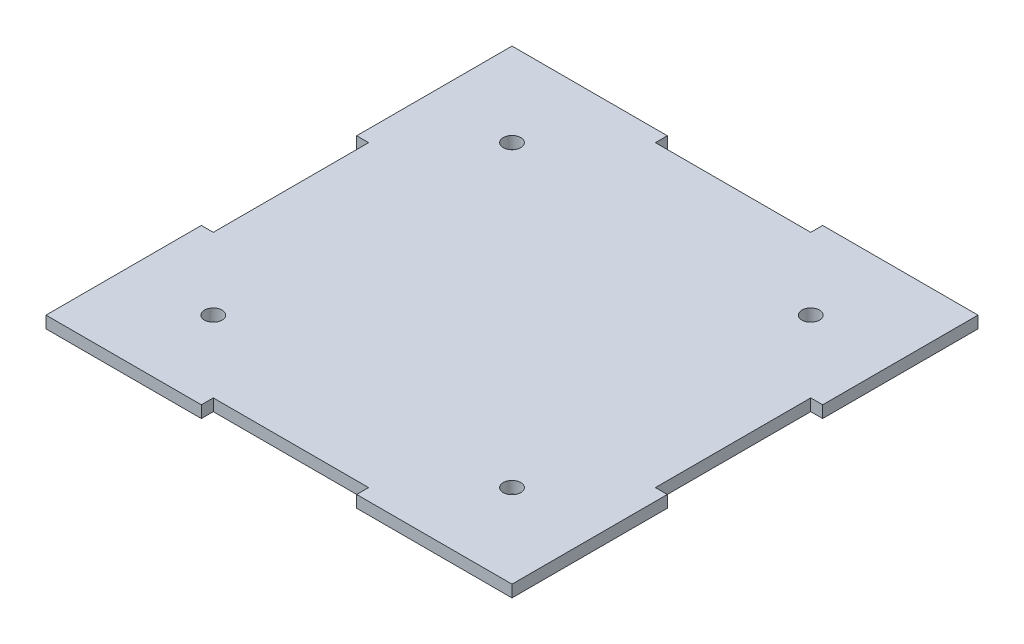
ISO-10303-21;
HEADER;
FILE_DESCRIPTION(('STEP AP214'),'2;1');
FILE_NAME('part.step','',(''),(''),'','','');
FILE_SCHEMA(('AUTOMOTIVE_DESIGN { 1 0 10303 214 1 1 1 1 }'));
ENDSEC;
DATA;
#1=APPLICATION_CONTEXT('core data for automotive mechanical design processes');
#2=APPLICATION_PROTOCOL_DEFINITION('international standard','automotive_design',2000,#1);
#3=PRODUCT_CONTEXT('',#1,'mechanical');
#4=PRODUCT('Part','Part','',(#3));
#5=PRODUCT_RELATED_PRODUCT_CATEGORY('part','',(#4));
#6=PRODUCT_DEFINITION_FORMATION('','',#4);
#7=PRODUCT_DEFINITION_CONTEXT('part definition',#1,'design');
#8=PRODUCT_DEFINITION('design','',#6,#7);
#9=PRODUCT_DEFINITION_SHAPE('','',#8);
#10=(LENGTH_UNIT() NAMED_UNIT(*) SI_UNIT(.MILLI.,.METRE.));
#11=(NAMED_UNIT(*) PLANE_ANGLE_UNIT() SI_UNIT($,.RADIAN.));
#12=(NAMED_UNIT(*) SI_UNIT($,.STERADIAN.) SOLID_ANGLE_UNIT());
#13=UNCERTAINTY_MEASURE_WITH_UNIT(LENGTH_MEASURE(1.E-05),#10,'distance_accuracy_value','');
#14=(GEOMETRIC_REPRESENTATION_CONTEXT(3) GLOBAL_UNCERTAINTY_ASSIGNED_CONTEXT((#13)) GLOBAL_UNIT_ASSIGNED_CONTEXT((#10,
#11,#12)) REPRESENTATION_CONTEXT('',''));
#15=CARTESIAN_POINT('',(0.,0.,0.));
#16=DIRECTION('',(0.,0.,1.));
#17=DIRECTION('',(1.,0.,0.));
#18=AXIS2_PLACEMENT_3D('',#15,#16,#17);
#19=CARTESIAN_POINT('',(0.,3.,0.));
#20=DIRECTION('',(0.,-1.,0.));
#21=DIRECTION('',(0.,0.,-1.));
#22=AXIS2_PLACEMENT_3D('',#19,#20,#21);
#23=PLANE('',#22);
#24=DIRECTION('',(0.,0.,-1.));
#25=VECTOR('',#24,1.);
#26=CARTESIAN_POINT('',(58.5,3.,-58.5));
#27=LINE('',#26,#25);
#28=CARTESIAN_POINT('',(58.5,3.,-19.5));
#29=VERTEX_POINT('',#28);
#30=CARTESIAN_POINT('',(58.5,3.,-58.5));
#31=VERTEX_POINT('',#30);
#32=EDGE_CURVE('E241',#29,#31,#27,.T.);
#33=ORIENTED_EDGE('',*,*,#32,.T.);
#34=DIRECTION('',(-1.,0.,0.));
#35=VECTOR('',#34,1.);
#36=CARTESIAN_POINT('',(19.5,3.,-58.5));
#37=LINE('',#36,#35);
#38=CARTESIAN_POINT('',(19.5,3.,-58.5));
#39=VERTEX_POINT('',#38);
#40=EDGE_CURVE('E129',#31,#39,#37,.T.);
#41=ORIENTED_EDGE('',*,*,#40,.T.);
#42=DIRECTION('',(0.,0.,1.));
#43=VECTOR('',#42,1.);
#44=CARTESIAN_POINT('',(19.5,3.,-55.5));
#45=LINE('',#44,#43);
#46=CARTESIAN_POINT('',(19.5,3.,-55.5));
#47=VERTEX_POINT('',#46);
#48=EDGE_CURVE('E292',#39,#47,#45,.T.);
#49=ORIENTED_EDGE('',*,*,#48,.T.);
#50=DIRECTION('',(-1.,0.,0.));
#51=VECTOR('',#50,1.);
#52=CARTESIAN_POINT('',(-19.5,3.,-55.5));
#53=LINE('',#52,#51);
#54=CARTESIAN_POINT('',(-19.5,3.,-55.5));
#55=VERTEX_POINT('',#54);
#56=EDGE_CURVE('E311',#47,#55,#53,.T.);
#57=ORIENTED_EDGE('',*,*,#56,.T.);
#58=DIRECTION('',(0.,0.,-1.));
#59=VECTOR('',#58,1.);
#60=CARTESIAN_POINT('',(-19.5,3.,-58.5));
#61=LINE('',#60,#59);
#62=CARTESIAN_POINT('',(-19.5,3.,-58.5));
#63=VERTEX_POINT('',#62);
#64=EDGE_CURVE('E308',#55,#63,#61,.T.);
#65=ORIENTED_EDGE('',*,*,#64,.T.);
#66=DIRECTION('',(-1.,0.,0.));
#67=VECTOR('',#66,1.);
#68=CARTESIAN_POINT('',(-58.5,3.,-58.5));
#69=LINE('',#68,#67);
#70=CARTESIAN_POINT('',(-58.5,3.,-58.5));
#71=VERTEX_POINT('',#70);
#72=EDGE_CURVE('E310',#63,#71,#69,.T.);
#73=ORIENTED_EDGE('',*,*,#72,.T.);
#74=DIRECTION('',(0.,0.,1.));
#75=VECTOR('',#74,1.);
#76=CARTESIAN_POINT('',(-58.5,3.,-19.5));
#77=LINE('',#76,#75);
#78=CARTESIAN_POINT('',(-58.5,3.,-19.5));
#79=VERTEX_POINT('',#78);
#80=EDGE_CURVE('E313',#71,#79,#77,.T.);
#81=ORIENTED_EDGE('',*,*,#80,.T.);
#82=DIRECTION('',(1.,0.,0.));
#83=VECTOR('',#82,1.);
#84=CARTESIAN_POINT('',(-55.5,3.,-19.5));
#85=LINE('',#84,#83);
#86=CARTESIAN_POINT('',(-55.5,3.,-19.5));
#87=VERTEX_POINT('',#86);
#88=EDGE_CURVE('E319',#79,#87,#85,.T.);
#89=ORIENTED_EDGE('',*,*,#88,.T.);
#90=DIRECTION('',(0.,0.,1.));
#91=VECTOR('',#90,1.);
#92=CARTESIAN_POINT('',(-55.5,3.,19.5));
#93=LINE('',#92,#91);
#94=CARTESIAN_POINT('',(-55.5,3.,19.5));
#95=VERTEX_POINT('',#94);
#96=EDGE_CURVE('E321',#87,#95,#93,.T.);
#97=ORIENTED_EDGE('',*,*,#96,.T.);
#98=DIRECTION('',(-1.,0.,0.));
#99=VECTOR('',#98,1.);
#100=CARTESIAN_POINT('',(-58.5,3.,19.5));
#101=LINE('',#100,#99);
#102=CARTESIAN_POINT('',(-58.5,3.,19.5));
#103=VERTEX_POINT('',#102);
#104=EDGE_CURVE('E323',#95,#103,#101,.T.);
#105=ORIENTED_EDGE('',*,*,#104,.T.);
#106=DIRECTION('',(0.,0.,1.));
#107=VECTOR('',#106,1.);
#108=CARTESIAN_POINT('',(-58.5,3.,58.5));
#109=LINE('',#108,#107);
#110=CARTESIAN_POINT('',(-58.5,3.,58.5));
#111=VERTEX_POINT('',#110);
#112=EDGE_CURVE('E325',#103,#111,#109,.T.);
#113=ORIENTED_EDGE('',*,*,#112,.T.);
#114=DIRECTION('',(1.,0.,0.));
#115=VECTOR('',#114,1.);
#116=CARTESIAN_POINT('',(-19.5,3.,58.5));
#117=LINE('',#116,#115);
#118=CARTESIAN_POINT('',(-19.5,3.,58.5));
#119=VERTEX_POINT('',#118);
#120=EDGE_CURVE('E327',#111,#119,#117,.T.);
#121=ORIENTED_EDGE('',*,*,#120,.T.);
#122=DIRECTION('',(0.,0.,-1.));
#123=VECTOR('',#122,1.);
#124=CARTESIAN_POINT('',(-19.5,3.,55.5));
#125=LINE('',#124,#123);
#126=CARTESIAN_POINT('',(-19.5,3.,55.5));
#127=VERTEX_POINT('',#126);
#128=EDGE_CURVE('E329',#119,#127,#125,.T.);
#129=ORIENTED_EDGE('',*,*,#128,.T.);
#130=DIRECTION('',(1.,0.,0.));
#131=VECTOR('',#130,1.);
#132=CARTESIAN_POINT('',(19.5,3.,55.5));
#133=LINE('',#132,#131);
#134=CARTESIAN_POINT('',(19.5,3.,55.5));
#135=VERTEX_POINT('',#134);
#136=EDGE_CURVE('E331',#127,#135,#133,.T.);
#137=ORIENTED_EDGE('',*,*,#136,.T.);
#138=DIRECTION('',(0.,0.,1.));
#139=VECTOR('',#138,1.);
#140=CARTESIAN_POINT('',(19.5,3.,58.5));
#141=LINE('',#140,#139);
#142=CARTESIAN_POINT('',(19.5,3.,58.5));
#143=VERTEX_POINT('',#142);
#144=EDGE_CURVE('E333',#135,#143,#141,.T.);
#145=ORIENTED_EDGE('',*,*,#144,.T.);
#146=DIRECTION('',(1.,0.,0.));
#147=VECTOR('',#146,1.);
#148=CARTESIAN_POINT('',(58.5,3.,58.5));
#149=LINE('',#148,#147);
#150=CARTESIAN_POINT('',(58.5,3.,58.5));
#151=VERTEX_POINT('',#150);
#152=EDGE_CURVE('E335',#143,#151,#149,.T.);
#153=ORIENTED_EDGE('',*,*,#152,.T.);
#154=DIRECTION('',(0.,0.,-1.));
#155=VECTOR('',#154,1.);
#156=CARTESIAN_POINT('',(58.5,3.,19.5));
#157=LINE('',#156,#155);
#158=CARTESIAN_POINT('',(58.5,3.,19.5));
#159=VERTEX_POINT('',#158);
#160=EDGE_CURVE('E184',#151,#159,#157,.T.);
#161=ORIENTED_EDGE('',*,*,#160,.T.);
#162=DIRECTION('',(-1.,0.,0.));
#163=VECTOR('',#162,1.);
#164=CARTESIAN_POINT('',(55.5,3.,19.5));
#165=LINE('',#164,#163);
#166=CARTESIAN_POINT('',(55.5,3.,19.5));
#167=VERTEX_POINT('',#166);
#168=EDGE_CURVE('E178',#159,#167,#165,.T.);
#169=ORIENTED_EDGE('',*,*,#168,.T.);
#170=DIRECTION('',(0.,0.,-1.));
#171=VECTOR('',#170,1.);
#172=CARTESIAN_POINT('',(55.5,3.,-19.5));
#173=LINE('',#172,#171);
#174=CARTESIAN_POINT('',(55.5,3.,-19.5));
#175=VERTEX_POINT('',#174);
#176=EDGE_CURVE('E182',#167,#175,#173,.T.);
#177=ORIENTED_EDGE('',*,*,#176,.T.);
#178=DIRECTION('',(1.,0.,0.));
#179=VECTOR('',#178,1.);
#180=CARTESIAN_POINT('',(58.5,3.,-19.5));
#181=LINE('',#180,#179);
#182=EDGE_CURVE('E50',#175,#29,#181,.T.);
#183=ORIENTED_EDGE('',*,*,#182,.T.);
#184=EDGE_LOOP('',(#33,#41,#49,#57,#65,#73,#81,#89,#97,#105,#113,#121,#129,#137,#145,#153,#161,
#169,#177,#183));
#185=FACE_BOUND('',#184,.T.);
#186=CARTESIAN_POINT('',(-37.5,3.,-37.5));
#187=DIRECTION('',(0.,1.,0.));
#188=DIRECTION('',(0.,0.,1.));
#189=AXIS2_PLACEMENT_3D('',#186,#187,#188);
#190=CIRCLE('',#189,2.2);
#191=CARTESIAN_POINT('',(-37.5,3.,-35.3));
#192=VERTEX_POINT('',#191);
#193=EDGE_CURVE('E206',#192,#192,#190,.T.);
#194=ORIENTED_EDGE('',*,*,#193,.F.);
#195=EDGE_LOOP('',(#194));
#196=FACE_BOUND('',#195,.T.);
#197=CARTESIAN_POINT('',(37.5,3.,-37.5));
#198=DIRECTION('',(0.,1.,0.));
#199=DIRECTION('',(0.,0.,1.));
#200=AXIS2_PLACEMENT_3D('',#197,#198,#199);
#201=CIRCLE('',#200,2.2);
#202=CARTESIAN_POINT('',(37.5,3.,-35.3));
#203=VERTEX_POINT('',#202);
#204=EDGE_CURVE('E399',#203,#203,#201,.T.);
#205=ORIENTED_EDGE('',*,*,#204,.F.);
#206=EDGE_LOOP('',(#205));
#207=FACE_BOUND('',#206,.T.);
#208=CARTESIAN_POINT('',(37.5,3.,37.5));
#209=DIRECTION('',(0.,1.,0.));
#210=DIRECTION('',(0.,0.,1.));
#211=AXIS2_PLACEMENT_3D('',#208,#209,#210);
#212=CIRCLE('',#211,2.2);
#213=CARTESIAN_POINT('',(37.5,3.,39.7));
#214=VERTEX_POINT('',#213);
#215=EDGE_CURVE('E393',#214,#214,#212,.T.);
#216=ORIENTED_EDGE('',*,*,#215,.F.);
#217=EDGE_LOOP('',(#216));
#218=FACE_BOUND('',#217,.T.);
#219=CARTESIAN_POINT('',(-37.5,3.,37.5));
#220=DIRECTION('',(0.,1.,0.));
#221=DIRECTION('',(0.,0.,1.));
#222=AXIS2_PLACEMENT_3D('',#219,#220,#221);
#223=CIRCLE('',#222,2.2);
#224=CARTESIAN_POINT('',(-37.5,3.,39.7));
#225=VERTEX_POINT('',#224);
#226=EDGE_CURVE('E384',#225,#225,#223,.T.);
#227=ORIENTED_EDGE('',*,*,#226,.F.);
#228=EDGE_LOOP('',(#227));
#229=FACE_BOUND('',#228,.T.);
#230=ADVANCED_FACE('F33',(#185,#196,#207,#218,#229),#23,.F.);
#231=CARTESIAN_POINT('',(0.,0.,0.));
#232=DIRECTION('',(0.,-1.,0.));
#233=DIRECTION('',(0.,0.,-1.));
#234=AXIS2_PLACEMENT_3D('',#231,#232,#233);
#235=PLANE('',#234);
#236=CARTESIAN_POINT('',(37.5,0.,37.5));
#237=DIRECTION('',(0.,1.,0.));
#238=DIRECTION('',(0.,0.,1.));
#239=AXIS2_PLACEMENT_3D('',#236,#237,#238);
#240=CIRCLE('',#239,2.2);
#241=CARTESIAN_POINT('',(37.5,0.,39.7));
#242=VERTEX_POINT('',#241);
#243=EDGE_CURVE('E390',#242,#242,#240,.T.);
#244=ORIENTED_EDGE('',*,*,#243,.T.);
#245=EDGE_LOOP('',(#244));
#246=FACE_BOUND('',#245,.T.);
#247=CARTESIAN_POINT('',(-37.5,0.,-37.5));
#248=DIRECTION('',(0.,1.,0.));
#249=DIRECTION('',(0.,0.,1.));
#250=AXIS2_PLACEMENT_3D('',#247,#248,#249);
#251=CIRCLE('',#250,2.2);
#252=CARTESIAN_POINT('',(-37.5,0.,-35.3));
#253=VERTEX_POINT('',#252);
#254=EDGE_CURVE('E402',#253,#253,#251,.T.);
#255=ORIENTED_EDGE('',*,*,#254,.T.);
#256=EDGE_LOOP('',(#255));
#257=FACE_BOUND('',#256,.T.);
#258=DIRECTION('',(0.,0.,-1.));
#259=VECTOR('',#258,1.);
#260=CARTESIAN_POINT('',(58.5,0.,-58.5));
#261=LINE('',#260,#259);
#262=CARTESIAN_POINT('',(58.5,0.,-19.5));
#263=VERTEX_POINT('',#262);
#264=CARTESIAN_POINT('',(58.5,0.,-58.5));
#265=VERTEX_POINT('',#264);
#266=EDGE_CURVE('E202',#263,#265,#261,.T.);
#267=ORIENTED_EDGE('',*,*,#266,.F.);
#268=DIRECTION('',(1.,0.,0.));
#269=VECTOR('',#268,1.);
#270=CARTESIAN_POINT('',(58.5,0.,-19.5));
#271=LINE('',#270,#269);
#272=CARTESIAN_POINT('',(55.5,0.,-19.5));
#273=VERTEX_POINT('',#272);
#274=EDGE_CURVE('E121',#273,#263,#271,.T.);
#275=ORIENTED_EDGE('',*,*,#274,.F.);
#276=DIRECTION('',(0.,0.,-1.));
#277=VECTOR('',#276,1.);
#278=CARTESIAN_POINT('',(55.5,0.,-19.5));
#279=LINE('',#278,#277);
#280=CARTESIAN_POINT('',(55.5,0.,19.5));
#281=VERTEX_POINT('',#280);
#282=EDGE_CURVE('E115',#281,#273,#279,.T.);
#283=ORIENTED_EDGE('',*,*,#282,.F.);
#284=DIRECTION('',(-1.,0.,0.));
#285=VECTOR('',#284,1.);
#286=CARTESIAN_POINT('',(55.5,0.,19.5));
#287=LINE('',#286,#285);
#288=CARTESIAN_POINT('',(58.5,0.,19.5));
#289=VERTEX_POINT('',#288);
#290=EDGE_CURVE('E192',#289,#281,#287,.T.);
#291=ORIENTED_EDGE('',*,*,#290,.F.);
#292=DIRECTION('',(0.,0.,-1.));
#293=VECTOR('',#292,1.);
#294=CARTESIAN_POINT('',(58.5,0.,19.5));
#295=LINE('',#294,#293);
#296=CARTESIAN_POINT('',(58.5,0.,58.5));
#297=VERTEX_POINT('',#296);
#298=EDGE_CURVE('E236',#297,#289,#295,.T.);
#299=ORIENTED_EDGE('',*,*,#298,.F.);
#300=DIRECTION('',(1.,0.,0.));
#301=VECTOR('',#300,1.);
#302=CARTESIAN_POINT('',(58.5,0.,58.5));
#303=LINE('',#302,#301);
#304=CARTESIAN_POINT('',(19.5,0.,58.5));
#305=VERTEX_POINT('',#304);
#306=EDGE_CURVE('E234',#305,#297,#303,.T.);
#307=ORIENTED_EDGE('',*,*,#306,.F.);
#308=DIRECTION('',(0.,0.,1.));
#309=VECTOR('',#308,1.);
#310=CARTESIAN_POINT('',(19.5,0.,58.5));
#311=LINE('',#310,#309);
#312=CARTESIAN_POINT('',(19.5,0.,55.5));
#313=VERTEX_POINT('',#312);
#314=EDGE_CURVE('E232',#313,#305,#311,.T.);
#315=ORIENTED_EDGE('',*,*,#314,.F.);
#316=DIRECTION('',(1.,0.,0.));
#317=VECTOR('',#316,1.);
#318=CARTESIAN_POINT('',(19.5,0.,55.5));
#319=LINE('',#318,#317);
#320=CARTESIAN_POINT('',(-19.5,0.,55.5));
#321=VERTEX_POINT('',#320);
#322=EDGE_CURVE('E230',#321,#313,#319,.T.);
#323=ORIENTED_EDGE('',*,*,#322,.F.);
#324=DIRECTION('',(0.,0.,-1.));
#325=VECTOR('',#324,1.);
#326=CARTESIAN_POINT('',(-19.5,0.,55.5));
#327=LINE('',#326,#325);
#328=CARTESIAN_POINT('',(-19.5,0.,58.5));
#329=VERTEX_POINT('',#328);
#330=EDGE_CURVE('E228',#329,#321,#327,.T.);
#331=ORIENTED_EDGE('',*,*,#330,.F.);
#332=DIRECTION('',(1.,0.,0.));
#333=VECTOR('',#332,1.);
#334=CARTESIAN_POINT('',(-19.5,0.,58.5));
#335=LINE('',#334,#333);
#336=CARTESIAN_POINT('',(-58.5,0.,58.5));
#337=VERTEX_POINT('',#336);
#338=EDGE_CURVE('E226',#337,#329,#335,.T.);
#339=ORIENTED_EDGE('',*,*,#338,.F.);
#340=DIRECTION('',(0.,0.,1.));
#341=VECTOR('',#340,1.);
#342=CARTESIAN_POINT('',(-58.5,0.,58.5));
#343=LINE('',#342,#341);
#344=CARTESIAN_POINT('',(-58.5,0.,19.5));
#345=VERTEX_POINT('',#344);
#346=EDGE_CURVE('E224',#345,#337,#343,.T.);
#347=ORIENTED_EDGE('',*,*,#346,.F.);
#348=DIRECTION('',(-1.,0.,0.));
#349=VECTOR('',#348,1.);
#350=CARTESIAN_POINT('',(-58.5,0.,19.5));
#351=LINE('',#350,#349);
#352=CARTESIAN_POINT('',(-55.5,0.,19.5));
#353=VERTEX_POINT('',#352);
#354=EDGE_CURVE('E222',#353,#345,#351,.T.);
#355=ORIENTED_EDGE('',*,*,#354,.F.);
#356=DIRECTION('',(0.,0.,1.));
#357=VECTOR('',#356,1.);
#358=CARTESIAN_POINT('',(-55.5,0.,19.5));
#359=LINE('',#358,#357);
#360=CARTESIAN_POINT('',(-55.5,0.,-19.5));
#361=VERTEX_POINT('',#360);
#362=EDGE_CURVE('E220',#361,#353,#359,.T.);
#363=ORIENTED_EDGE('',*,*,#362,.F.);
#364=DIRECTION('',(1.,0.,0.));
#365=VECTOR('',#364,1.);
#366=CARTESIAN_POINT('',(-55.5,0.,-19.5));
#367=LINE('',#366,#365);
#368=CARTESIAN_POINT('',(-58.5,0.,-19.5));
#369=VERTEX_POINT('',#368);
#370=EDGE_CURVE('E218',#369,#361,#367,.T.);
#371=ORIENTED_EDGE('',*,*,#370,.F.);
#372=DIRECTION('',(0.,0.,1.));
#373=VECTOR('',#372,1.);
#374=CARTESIAN_POINT('',(-58.5,0.,-19.5));
#375=LINE('',#374,#373);
#376=CARTESIAN_POINT('',(-58.5,0.,-58.5));
#377=VERTEX_POINT('',#376);
#378=EDGE_CURVE('E216',#377,#369,#375,.T.);
#379=ORIENTED_EDGE('',*,*,#378,.F.);
#380=DIRECTION('',(-1.,0.,0.));
#381=VECTOR('',#380,1.);
#382=CARTESIAN_POINT('',(-58.5,0.,-58.5));
#383=LINE('',#382,#381);
#384=CARTESIAN_POINT('',(-19.5,0.,-58.5));
#385=VERTEX_POINT('',#384);
#386=EDGE_CURVE('E214',#385,#377,#383,.T.);
#387=ORIENTED_EDGE('',*,*,#386,.F.);
#388=DIRECTION('',(0.,0.,-1.));
#389=VECTOR('',#388,1.);
#390=CARTESIAN_POINT('',(-19.5,0.,-58.5));
#391=LINE('',#390,#389);
#392=CARTESIAN_POINT('',(-19.5,0.,-55.5));
#393=VERTEX_POINT('',#392);
#394=EDGE_CURVE('E212',#393,#385,#391,.T.);
#395=ORIENTED_EDGE('',*,*,#394,.F.);
#396=DIRECTION('',(-1.,0.,0.));
#397=VECTOR('',#396,1.);
#398=CARTESIAN_POINT('',(-19.5,0.,-55.5));
#399=LINE('',#398,#397);
#400=CARTESIAN_POINT('',(19.5,0.,-55.5));
#401=VERTEX_POINT('',#400);
#402=EDGE_CURVE('E210',#401,#393,#399,.T.);
#403=ORIENTED_EDGE('',*,*,#402,.F.);
#404=DIRECTION('',(0.,0.,1.));
#405=VECTOR('',#404,1.);
#406=CARTESIAN_POINT('',(19.5,0.,-55.5));
#407=LINE('',#406,#405);
#408=CARTESIAN_POINT('',(19.5,0.,-58.5));
#409=VERTEX_POINT('',#408);
#410=EDGE_CURVE('E208',#409,#401,#407,.T.);
#411=ORIENTED_EDGE('',*,*,#410,.F.);
#412=DIRECTION('',(-1.,0.,0.));
#413=VECTOR('',#412,1.);
#414=CARTESIAN_POINT('',(19.5,0.,-58.5));
#415=LINE('',#414,#413);
#416=EDGE_CURVE('E205',#265,#409,#415,.T.);
#417=ORIENTED_EDGE('',*,*,#416,.F.);
#418=EDGE_LOOP('',(#267,#275,#283,#291,#299,#307,#315,#323,#331,#339,#347,#355,#363,#371,#379,
#387,#395,#403,#411,#417));
#419=FACE_BOUND('',#418,.T.);
#420=CARTESIAN_POINT('',(37.5,0.,-37.5));
#421=DIRECTION('',(0.,1.,0.));
#422=DIRECTION('',(0.,0.,1.));
#423=AXIS2_PLACEMENT_3D('',#420,#421,#422);
#424=CIRCLE('',#423,2.2);
#425=CARTESIAN_POINT('',(37.5,0.,-35.3));
#426=VERTEX_POINT('',#425);
#427=EDGE_CURVE('E396',#426,#426,#424,.T.);
#428=ORIENTED_EDGE('',*,*,#427,.T.);
#429=EDGE_LOOP('',(#428));
#430=FACE_BOUND('',#429,.T.);
#431=CARTESIAN_POINT('',(-37.5,0.,37.5));
#432=DIRECTION('',(0.,1.,0.));
#433=DIRECTION('',(0.,0.,1.));
#434=AXIS2_PLACEMENT_3D('',#431,#432,#433);
#435=CIRCLE('',#434,2.2);
#436=CARTESIAN_POINT('',(-37.5,0.,39.7));
#437=VERTEX_POINT('',#436);
#438=EDGE_CURVE('E387',#437,#437,#435,.T.);
#439=ORIENTED_EDGE('',*,*,#438,.T.);
#440=EDGE_LOOP('',(#439));
#441=FACE_BOUND('',#440,.T.);
#442=ADVANCED_FACE('F296',(#246,#257,#419,#430,#441),#235,.T.);
#443=CARTESIAN_POINT('',(58.5,3.,-58.5));
#444=DIRECTION('',(-1.,0.,0.));
#445=DIRECTION('',(0.,0.,1.));
#446=AXIS2_PLACEMENT_3D('',#443,#444,#445);
#447=PLANE('',#446);
#448=ORIENTED_EDGE('',*,*,#266,.T.);
#449=DIRECTION('',(0.,-1.,0.));
#450=VECTOR('',#449,1.);
#451=CARTESIAN_POINT('',(58.5,3.,-58.5));
#452=LINE('',#451,#450);
#453=EDGE_CURVE('E11',#31,#265,#452,.T.);
#454=ORIENTED_EDGE('',*,*,#453,.F.);
#455=ORIENTED_EDGE('',*,*,#32,.F.);
#456=DIRECTION('',(0.,-1.,0.));
#457=VECTOR('',#456,1.);
#458=CARTESIAN_POINT('',(58.5,3.,-19.5));
#459=LINE('',#458,#457);
#460=EDGE_CURVE('E198',#29,#263,#459,.T.);
#461=ORIENTED_EDGE('',*,*,#460,.T.);
#462=EDGE_LOOP('',(#448,#454,#455,#461));
#463=FACE_BOUND('',#462,.T.);
#464=ADVANCED_FACE('F35',(#463),#447,.F.);
#465=CARTESIAN_POINT('',(19.5,3.,-58.5));
#466=DIRECTION('',(0.,0.,1.));
#467=DIRECTION('',(1.,0.,0.));
#468=AXIS2_PLACEMENT_3D('',#465,#466,#467);
#469=PLANE('',#468);
#470=ORIENTED_EDGE('',*,*,#416,.T.);
#471=DIRECTION('',(0.,-1.,0.));
#472=VECTOR('',#471,1.);
#473=CARTESIAN_POINT('',(19.5,3.,-58.5));
#474=LINE('',#473,#472);
#475=EDGE_CURVE('E42',#39,#409,#474,.T.);
#476=ORIENTED_EDGE('',*,*,#475,.F.);
#477=ORIENTED_EDGE('',*,*,#40,.F.);
#478=ORIENTED_EDGE('',*,*,#453,.T.);
#479=EDGE_LOOP('',(#470,#476,#477,#478));
#480=FACE_BOUND('',#479,.T.);
#481=ADVANCED_FACE('F594',(#480),#469,.F.);
#482=CARTESIAN_POINT('',(19.5,3.,-55.5));
#483=DIRECTION('',(1.,0.,0.));
#484=DIRECTION('',(0.,0.,-1.));
#485=AXIS2_PLACEMENT_3D('',#482,#483,#484);
#486=PLANE('',#485);
#487=ORIENTED_EDGE('',*,*,#410,.T.);
#488=DIRECTION('',(0.,-1.,0.));
#489=VECTOR('',#488,1.);
#490=CARTESIAN_POINT('',(19.5,3.,-55.5));
#491=LINE('',#490,#489);
#492=EDGE_CURVE('E284',#47,#401,#491,.T.);
#493=ORIENTED_EDGE('',*,*,#492,.F.);
#494=ORIENTED_EDGE('',*,*,#48,.F.);
#495=ORIENTED_EDGE('',*,*,#475,.T.);
#496=EDGE_LOOP('',(#487,#493,#494,#495));
#497=FACE_BOUND('',#496,.T.);
#498=ADVANCED_FACE('F290',(#497),#486,.F.);
#499=CARTESIAN_POINT('',(-19.5,3.,-55.5));
#500=DIRECTION('',(0.,0.,1.));
#501=DIRECTION('',(1.,0.,0.));
#502=AXIS2_PLACEMENT_3D('',#499,#500,#501);
#503=PLANE('',#502);
#504=ORIENTED_EDGE('',*,*,#402,.T.);
#505=DIRECTION('',(0.,-1.,0.));
#506=VECTOR('',#505,1.);
#507=CARTESIAN_POINT('',(-19.5,3.,-55.5));
#508=LINE('',#507,#506);
#509=EDGE_CURVE('E281',#55,#393,#508,.T.);
#510=ORIENTED_EDGE('',*,*,#509,.F.);
#511=ORIENTED_EDGE('',*,*,#56,.F.);
#512=ORIENTED_EDGE('',*,*,#492,.T.);
#513=EDGE_LOOP('',(#504,#510,#511,#512));
#514=FACE_BOUND('',#513,.T.);
#515=ADVANCED_FACE('F302',(#514),#503,.F.);
#516=CARTESIAN_POINT('',(-19.5,3.,-58.5));
#517=DIRECTION('',(-1.,0.,0.));
#518=DIRECTION('',(0.,0.,1.));
#519=AXIS2_PLACEMENT_3D('',#516,#517,#518);
#520=PLANE('',#519);
#521=ORIENTED_EDGE('',*,*,#394,.T.);
#522=DIRECTION('',(0.,-1.,0.));
#523=VECTOR('',#522,1.);
#524=CARTESIAN_POINT('',(-19.5,3.,-58.5));
#525=LINE('',#524,#523);
#526=EDGE_CURVE('E278',#63,#385,#525,.T.);
#527=ORIENTED_EDGE('',*,*,#526,.F.);
#528=ORIENTED_EDGE('',*,*,#64,.F.);
#529=ORIENTED_EDGE('',*,*,#509,.T.);
#530=EDGE_LOOP('',(#521,#527,#528,#529));
#531=FACE_BOUND('',#530,.T.);
#532=ADVANCED_FACE('F306',(#531),#520,.F.);
#533=CARTESIAN_POINT('',(-58.5,3.,-58.5));
#534=DIRECTION('',(0.,0.,1.));
#535=DIRECTION('',(1.,0.,0.));
#536=AXIS2_PLACEMENT_3D('',#533,#534,#535);
#537=PLANE('',#536);
#538=ORIENTED_EDGE('',*,*,#386,.T.);
#539=DIRECTION('',(0.,-1.,0.));
#540=VECTOR('',#539,1.);
#541=CARTESIAN_POINT('',(-58.5,3.,-58.5));
#542=LINE('',#541,#540);
#543=EDGE_CURVE('E275',#71,#377,#542,.T.);
#544=ORIENTED_EDGE('',*,*,#543,.F.);
#545=ORIENTED_EDGE('',*,*,#72,.F.);
#546=ORIENTED_EDGE('',*,*,#526,.T.);
#547=EDGE_LOOP('',(#538,#544,#545,#546));
#548=FACE_BOUND('',#547,.T.);
#549=ADVANCED_FACE('F559',(#548),#537,.F.);
#550=CARTESIAN_POINT('',(-58.5,3.,-19.5));
#551=DIRECTION('',(1.,0.,0.));
#552=DIRECTION('',(0.,0.,-1.));
#553=AXIS2_PLACEMENT_3D('',#550,#551,#552);
#554=PLANE('',#553);
#555=ORIENTED_EDGE('',*,*,#378,.T.);
#556=DIRECTION('',(0.,-1.,0.));
#557=VECTOR('',#556,1.);
#558=CARTESIAN_POINT('',(-58.5,3.,-19.5));
#559=LINE('',#558,#557);
#560=EDGE_CURVE('E272',#79,#369,#559,.T.);
#561=ORIENTED_EDGE('',*,*,#560,.F.);
#562=ORIENTED_EDGE('',*,*,#80,.F.);
#563=ORIENTED_EDGE('',*,*,#543,.T.);
#564=EDGE_LOOP('',(#555,#561,#562,#563));
#565=FACE_BOUND('',#564,.T.);
#566=ADVANCED_FACE('F549',(#565),#554,.F.);
#567=CARTESIAN_POINT('',(-55.5,3.,-19.5));
#568=DIRECTION('',(0.,0.,-1.));
#569=DIRECTION('',(-1.,0.,0.));
#570=AXIS2_PLACEMENT_3D('',#567,#568,#569);
#571=PLANE('',#570);
#572=ORIENTED_EDGE('',*,*,#370,.T.);
#573=DIRECTION('',(0.,-1.,0.));
#574=VECTOR('',#573,1.);
#575=CARTESIAN_POINT('',(-55.5,3.,-19.5));
#576=LINE('',#575,#574);
#577=EDGE_CURVE('E269',#87,#361,#576,.T.);
#578=ORIENTED_EDGE('',*,*,#577,.F.);
#579=ORIENTED_EDGE('',*,*,#88,.F.);
#580=ORIENTED_EDGE('',*,*,#560,.T.);
#581=EDGE_LOOP('',(#572,#578,#579,#580));
#582=FACE_BOUND('',#581,.T.);
#583=ADVANCED_FACE('F539',(#582),#571,.F.);
#584=CARTESIAN_POINT('',(-55.5,3.,19.5));
#585=DIRECTION('',(1.,0.,0.));
#586=DIRECTION('',(0.,0.,-1.));
#587=AXIS2_PLACEMENT_3D('',#584,#585,#586);
#588=PLANE('',#587);
#589=ORIENTED_EDGE('',*,*,#362,.T.);
#590=DIRECTION('',(0.,-1.,0.));
#591=VECTOR('',#590,1.);
#592=CARTESIAN_POINT('',(-55.5,3.,19.5));
#593=LINE('',#592,#591);
#594=EDGE_CURVE('E266',#95,#353,#593,.T.);
#595=ORIENTED_EDGE('',*,*,#594,.F.);
#596=ORIENTED_EDGE('',*,*,#96,.F.);
#597=ORIENTED_EDGE('',*,*,#577,.T.);
#598=EDGE_LOOP('',(#589,#595,#596,#597));
#599=FACE_BOUND('',#598,.T.);
#600=ADVANCED_FACE('F529',(#599),#588,.F.);
#601=CARTESIAN_POINT('',(-58.5,3.,19.5));
#602=DIRECTION('',(0.,0.,1.));
#603=DIRECTION('',(1.,0.,0.));
#604=AXIS2_PLACEMENT_3D('',#601,#602,#603);
#605=PLANE('',#604);
#606=ORIENTED_EDGE('',*,*,#354,.T.);
#607=DIRECTION('',(0.,-1.,0.));
#608=VECTOR('',#607,1.);
#609=CARTESIAN_POINT('',(-58.5,3.,19.5));
#610=LINE('',#609,#608);
#611=EDGE_CURVE('E263',#103,#345,#610,.T.);
#612=ORIENTED_EDGE('',*,*,#611,.F.);
#613=ORIENTED_EDGE('',*,*,#104,.F.);
#614=ORIENTED_EDGE('',*,*,#594,.T.);
#615=EDGE_LOOP('',(#606,#612,#613,#614));
#616=FACE_BOUND('',#615,.T.);
#617=ADVANCED_FACE('F519',(#616),#605,.F.);
#618=CARTESIAN_POINT('',(-58.5,3.,58.5));
#619=DIRECTION('',(1.,0.,0.));
#620=DIRECTION('',(0.,0.,-1.));
#621=AXIS2_PLACEMENT_3D('',#618,#619,#620);
#622=PLANE('',#621);
#623=ORIENTED_EDGE('',*,*,#346,.T.);
#624=DIRECTION('',(0.,-1.,0.));
#625=VECTOR('',#624,1.);
#626=CARTESIAN_POINT('',(-58.5,3.,58.5));
#627=LINE('',#626,#625);
#628=EDGE_CURVE('E260',#111,#337,#627,.T.);
#629=ORIENTED_EDGE('',*,*,#628,.F.);
#630=ORIENTED_EDGE('',*,*,#112,.F.);
#631=ORIENTED_EDGE('',*,*,#611,.T.);
#632=EDGE_LOOP('',(#623,#629,#630,#631));
#633=FACE_BOUND('',#632,.T.);
#634=ADVANCED_FACE('F509',(#633),#622,.F.);
#635=CARTESIAN_POINT('',(-19.5,3.,58.5));
#636=DIRECTION('',(0.,0.,-1.));
#637=DIRECTION('',(-1.,0.,0.));
#638=AXIS2_PLACEMENT_3D('',#635,#636,#637);
#639=PLANE('',#638);
#640=ORIENTED_EDGE('',*,*,#338,.T.);
#641=DIRECTION('',(0.,-1.,0.));
#642=VECTOR('',#641,1.);
#643=CARTESIAN_POINT('',(-19.5,3.,58.5));
#644=LINE('',#643,#642);
#645=EDGE_CURVE('E257',#119,#329,#644,.T.);
#646=ORIENTED_EDGE('',*,*,#645,.F.);
#647=ORIENTED_EDGE('',*,*,#120,.F.);
#648=ORIENTED_EDGE('',*,*,#628,.T.);
#649=EDGE_LOOP('',(#640,#646,#647,#648));
#650=FACE_BOUND('',#649,.T.);
#651=ADVANCED_FACE('F499',(#650),#639,.F.);
#652=CARTESIAN_POINT('',(-19.5,3.,55.5));
#653=DIRECTION('',(-1.,0.,0.));
#654=DIRECTION('',(0.,0.,1.));
#655=AXIS2_PLACEMENT_3D('',#652,#653,#654);
#656=PLANE('',#655);
#657=ORIENTED_EDGE('',*,*,#330,.T.);
#658=DIRECTION('',(0.,-1.,0.));
#659=VECTOR('',#658,1.);
#660=CARTESIAN_POINT('',(-19.5,3.,55.5));
#661=LINE('',#660,#659);
#662=EDGE_CURVE('E254',#127,#321,#661,.T.);
#663=ORIENTED_EDGE('',*,*,#662,.F.);
#664=ORIENTED_EDGE('',*,*,#128,.F.);
#665=ORIENTED_EDGE('',*,*,#645,.T.);
#666=EDGE_LOOP('',(#657,#663,#664,#665));
#667=FACE_BOUND('',#666,.T.);
#668=ADVANCED_FACE('F489',(#667),#656,.F.);
#669=CARTESIAN_POINT('',(19.5,3.,55.5));
#670=DIRECTION('',(0.,0.,-1.));
#671=DIRECTION('',(-1.,0.,0.));
#672=AXIS2_PLACEMENT_3D('',#669,#670,#671);
#673=PLANE('',#672);
#674=ORIENTED_EDGE('',*,*,#322,.T.);
#675=DIRECTION('',(0.,-1.,0.));
#676=VECTOR('',#675,1.);
#677=CARTESIAN_POINT('',(19.5,3.,55.5));
#678=LINE('',#677,#676);
#679=EDGE_CURVE('E251',#135,#313,#678,.T.);
#680=ORIENTED_EDGE('',*,*,#679,.F.);
#681=ORIENTED_EDGE('',*,*,#136,.F.);
#682=ORIENTED_EDGE('',*,*,#662,.T.);
#683=EDGE_LOOP('',(#674,#680,#681,#682));
#684=FACE_BOUND('',#683,.T.);
#685=ADVANCED_FACE('F479',(#684),#673,.F.);
#686=CARTESIAN_POINT('',(19.5,3.,58.5));
#687=DIRECTION('',(1.,0.,0.));
#688=DIRECTION('',(0.,0.,-1.));
#689=AXIS2_PLACEMENT_3D('',#686,#687,#688);
#690=PLANE('',#689);
#691=ORIENTED_EDGE('',*,*,#314,.T.);
#692=DIRECTION('',(0.,-1.,0.));
#693=VECTOR('',#692,1.);
#694=CARTESIAN_POINT('',(19.5,3.,58.5));
#695=LINE('',#694,#693);
#696=EDGE_CURVE('E248',#143,#305,#695,.T.);
#697=ORIENTED_EDGE('',*,*,#696,.F.);
#698=ORIENTED_EDGE('',*,*,#144,.F.);
#699=ORIENTED_EDGE('',*,*,#679,.T.);
#700=EDGE_LOOP('',(#691,#697,#698,#699));
#701=FACE_BOUND('',#700,.T.);
#702=ADVANCED_FACE('F470',(#701),#690,.F.);
#703=CARTESIAN_POINT('',(58.5,3.,58.5));
#704=DIRECTION('',(0.,0.,-1.));
#705=DIRECTION('',(-1.,0.,0.));
#706=AXIS2_PLACEMENT_3D('',#703,#704,#705);
#707=PLANE('',#706);
#708=ORIENTED_EDGE('',*,*,#306,.T.);
#709=DIRECTION('',(0.,-1.,0.));
#710=VECTOR('',#709,1.);
#711=CARTESIAN_POINT('',(58.5,3.,58.5));
#712=LINE('',#711,#710);
#713=EDGE_CURVE('E245',#151,#297,#712,.T.);
#714=ORIENTED_EDGE('',*,*,#713,.F.);
#715=ORIENTED_EDGE('',*,*,#152,.F.);
#716=ORIENTED_EDGE('',*,*,#696,.T.);
#717=EDGE_LOOP('',(#708,#714,#715,#716));
#718=FACE_BOUND('',#717,.T.);
#719=ADVANCED_FACE('F341',(#718),#707,.F.);
#720=CARTESIAN_POINT('',(58.5,3.,19.5));
#721=DIRECTION('',(-1.,0.,0.));
#722=DIRECTION('',(0.,0.,1.));
#723=AXIS2_PLACEMENT_3D('',#720,#721,#722);
#724=PLANE('',#723);
#725=ORIENTED_EDGE('',*,*,#298,.T.);
#726=DIRECTION('',(0.,-1.,0.));
#727=VECTOR('',#726,1.);
#728=CARTESIAN_POINT('',(58.5,3.,19.5));
#729=LINE('',#728,#727);
#730=EDGE_CURVE('E193',#159,#289,#729,.T.);
#731=ORIENTED_EDGE('',*,*,#730,.F.);
#732=ORIENTED_EDGE('',*,*,#160,.F.);
#733=ORIENTED_EDGE('',*,*,#713,.T.);
#734=EDGE_LOOP('',(#725,#731,#732,#733));
#735=FACE_BOUND('',#734,.T.);
#736=ADVANCED_FACE('F345',(#735),#724,.F.);
#737=CARTESIAN_POINT('',(55.5,3.,19.5));
#738=DIRECTION('',(0.,0.,1.));
#739=DIRECTION('',(1.,0.,0.));
#740=AXIS2_PLACEMENT_3D('',#737,#738,#739);
#741=PLANE('',#740);
#742=ORIENTED_EDGE('',*,*,#290,.T.);
#743=DIRECTION('',(0.,-1.,0.));
#744=VECTOR('',#743,1.);
#745=CARTESIAN_POINT('',(55.5,3.,19.5));
#746=LINE('',#745,#744);
#747=EDGE_CURVE('E189',#167,#281,#746,.T.);
#748=ORIENTED_EDGE('',*,*,#747,.F.);
#749=ORIENTED_EDGE('',*,*,#168,.F.);
#750=ORIENTED_EDGE('',*,*,#730,.T.);
#751=EDGE_LOOP('',(#742,#748,#749,#750));
#752=FACE_BOUND('',#751,.T.);
#753=ADVANCED_FACE('F190',(#752),#741,.F.);
#754=CARTESIAN_POINT('',(55.5,3.,-19.5));
#755=DIRECTION('',(-1.,0.,0.));
#756=DIRECTION('',(0.,0.,1.));
#757=AXIS2_PLACEMENT_3D('',#754,#755,#756);
#758=PLANE('',#757);
#759=ORIENTED_EDGE('',*,*,#282,.T.);
#760=DIRECTION('',(0.,-1.,0.));
#761=VECTOR('',#760,1.);
#762=CARTESIAN_POINT('',(55.5,3.,-19.5));
#763=LINE('',#762,#761);
#764=EDGE_CURVE('E194',#175,#273,#763,.T.);
#765=ORIENTED_EDGE('',*,*,#764,.F.);
#766=ORIENTED_EDGE('',*,*,#176,.F.);
#767=ORIENTED_EDGE('',*,*,#747,.T.);
#768=EDGE_LOOP('',(#759,#765,#766,#767));
#769=FACE_BOUND('',#768,.T.);
#770=ADVANCED_FACE('F196',(#769),#758,.F.);
#771=CARTESIAN_POINT('',(58.5,3.,-19.5));
#772=DIRECTION('',(0.,0.,-1.));
#773=DIRECTION('',(-1.,0.,0.));
#774=AXIS2_PLACEMENT_3D('',#771,#772,#773);
#775=PLANE('',#774);
#776=ORIENTED_EDGE('',*,*,#274,.T.);
#777=ORIENTED_EDGE('',*,*,#460,.F.);
#778=ORIENTED_EDGE('',*,*,#182,.F.);
#779=ORIENTED_EDGE('',*,*,#764,.T.);
#780=EDGE_LOOP('',(#776,#777,#778,#779));
#781=FACE_BOUND('',#780,.T.);
#782=ADVANCED_FACE('F349',(#781),#775,.F.);
#783=CARTESIAN_POINT('',(-37.5,3.,-37.5));
#784=DIRECTION('',(0.,-1.,0.));
#785=DIRECTION('',(0.,0.,-1.));
#786=AXIS2_PLACEMENT_3D('',#783,#784,#785);
#787=CYLINDRICAL_SURFACE('',#786,2.2);
#788=ORIENTED_EDGE('',*,*,#193,.T.);
#789=EDGE_LOOP('',(#788));
#790=FACE_BOUND('',#789,.T.);
#791=ORIENTED_EDGE('',*,*,#254,.F.);
#792=EDGE_LOOP('',(#791));
#793=FACE_BOUND('',#792,.T.);
#794=ADVANCED_FACE('F351',(#790,#793),#787,.F.);
#795=CARTESIAN_POINT('',(37.5,3.,-37.5));
#796=DIRECTION('',(0.,-1.,0.));
#797=DIRECTION('',(0.,0.,-1.));
#798=AXIS2_PLACEMENT_3D('',#795,#796,#797);
#799=CYLINDRICAL_SURFACE('',#798,2.2);
#800=ORIENTED_EDGE('',*,*,#204,.T.);
#801=EDGE_LOOP('',(#800));
#802=FACE_BOUND('',#801,.T.);
#803=ORIENTED_EDGE('',*,*,#427,.F.);
#804=EDGE_LOOP('',(#803));
#805=FACE_BOUND('',#804,.T.);
#806=ADVANCED_FACE('F357',(#802,#805),#799,.F.);
#807=CARTESIAN_POINT('',(37.5,3.,37.5));
#808=DIRECTION('',(0.,-1.,0.));
#809=DIRECTION('',(0.,0.,-1.));
#810=AXIS2_PLACEMENT_3D('',#807,#808,#809);
#811=CYLINDRICAL_SURFACE('',#810,2.2);
#812=ORIENTED_EDGE('',*,*,#215,.T.);
#813=EDGE_LOOP('',(#812));
#814=FACE_BOUND('',#813,.T.);
#815=ORIENTED_EDGE('',*,*,#243,.F.);
#816=EDGE_LOOP('',(#815));
#817=FACE_BOUND('',#816,.T.);
#818=ADVANCED_FACE('F371',(#814,#817),#811,.F.);
#819=CARTESIAN_POINT('',(-37.5,3.,37.5));
#820=DIRECTION('',(0.,-1.,0.));
#821=DIRECTION('',(0.,0.,-1.));
#822=AXIS2_PLACEMENT_3D('',#819,#820,#821);
#823=CYLINDRICAL_SURFACE('',#822,2.2);
#824=ORIENTED_EDGE('',*,*,#226,.T.);
#825=EDGE_LOOP('',(#824));
#826=FACE_BOUND('',#825,.T.);
#827=ORIENTED_EDGE('',*,*,#438,.F.);
#828=EDGE_LOOP('',(#827));
#829=FACE_BOUND('',#828,.T.);
#830=ADVANCED_FACE('F375',(#826,#829),#823,.F.);
#831=CLOSED_SHELL('',(#230,#442,#464,#481,#498,#515,#532,#549,#566,#583,#600,#617,#634,#651,
#668,#685,#702,#719,#736,#753,#770,#782,#794,#806,#818,#830));
#832=MANIFOLD_SOLID_BREP('B2',#831);
#833=ADVANCED_BREP_SHAPE_REPRESENTATION('',(#18,#832),#14);
#834=SHAPE_DEFINITION_REPRESENTATION(#9,#833);
ENDSEC;
END-ISO-10303-21;
